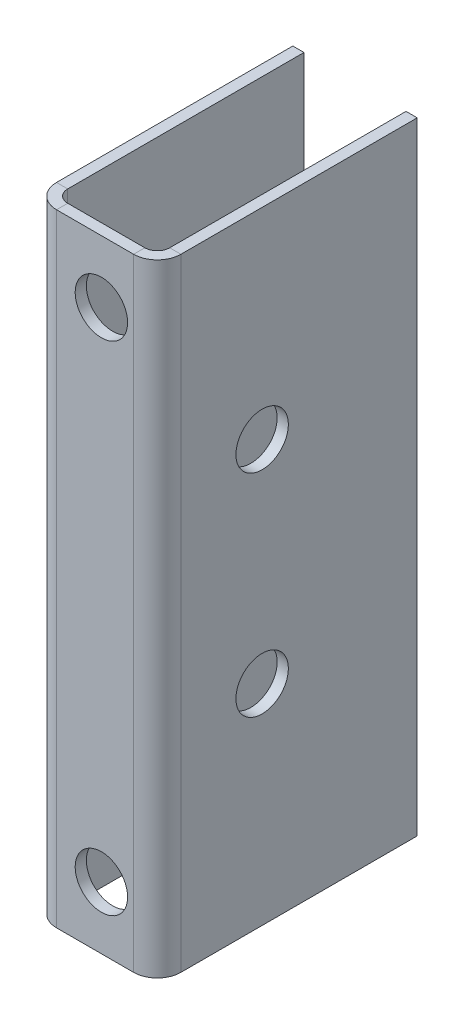
ISO-10303-21;
HEADER;
FILE_DESCRIPTION(('STEP AP214'),'2;1');
FILE_NAME('part.step','',(''),(''),'','','');
FILE_SCHEMA(('AUTOMOTIVE_DESIGN { 1 0 10303 214 1 1 1 1 }'));
ENDSEC;
DATA;
#1=APPLICATION_CONTEXT('core data for automotive mechanical design processes');
#2=APPLICATION_PROTOCOL_DEFINITION('international standard','automotive_design',2000,#1);
#3=PRODUCT_CONTEXT('',#1,'mechanical');
#4=PRODUCT('Part','Part','',(#3));
#5=PRODUCT_RELATED_PRODUCT_CATEGORY('part','',(#4));
#6=PRODUCT_DEFINITION_FORMATION('','',#4);
#7=PRODUCT_DEFINITION_CONTEXT('part definition',#1,'design');
#8=PRODUCT_DEFINITION('design','',#6,#7);
#9=PRODUCT_DEFINITION_SHAPE('','',#8);
#10=(LENGTH_UNIT() NAMED_UNIT(*) SI_UNIT(.MILLI.,.METRE.));
#11=(NAMED_UNIT(*) PLANE_ANGLE_UNIT() SI_UNIT($,.RADIAN.));
#12=(NAMED_UNIT(*) SI_UNIT($,.STERADIAN.) SOLID_ANGLE_UNIT());
#13=UNCERTAINTY_MEASURE_WITH_UNIT(LENGTH_MEASURE(1.E-05),#10,'distance_accuracy_value','');
#14=(GEOMETRIC_REPRESENTATION_CONTEXT(3) GLOBAL_UNCERTAINTY_ASSIGNED_CONTEXT((#13)) GLOBAL_UNIT_ASSIGNED_CONTEXT((#10,
#11,#12)) REPRESENTATION_CONTEXT('',''));
#15=CARTESIAN_POINT('',(0.,0.,0.));
#16=DIRECTION('',(0.,0.,1.));
#17=DIRECTION('',(1.,0.,0.));
#18=AXIS2_PLACEMENT_3D('',#15,#16,#17);
#19=CARTESIAN_POINT('',(0.,0.,-0.9));
#20=DIRECTION('',(0.,0.,1.));
#21=DIRECTION('',(1.,0.,0.));
#22=AXIS2_PLACEMENT_3D('',#19,#20,#21);
#23=PLANE('',#22);
#24=CARTESIAN_POINT('',(-3.83601900194463,40.5271084337349,-0.900000000000001));
#25=DIRECTION('',(0.,0.,-1.));
#26=DIRECTION('',(-1.,0.,0.));
#27=AXIS2_PLACEMENT_3D('',#24,#25,#26);
#28=CIRCLE('',#27,2.10819999999999);
#29=CARTESIAN_POINT('',(-5.94421900194462,40.5271084337349,-0.900000000000001));
#30=VERTEX_POINT('',#29);
#31=EDGE_CURVE('E301',#30,#30,#28,.T.);
#32=ORIENTED_EDGE('',*,*,#31,.F.);
#33=EDGE_LOOP('',(#32));
#34=FACE_BOUND('',#33,.T.);
#35=CARTESIAN_POINT('',(-3.83601900194463,0.527108433734945,-0.900000000000001));
#36=DIRECTION('',(0.,0.,-1.));
#37=DIRECTION('',(-1.,0.,0.));
#38=AXIS2_PLACEMENT_3D('',#35,#36,#37);
#39=CIRCLE('',#38,2.10819999999999);
#40=CARTESIAN_POINT('',(-5.94421900194462,0.527108433734945,-0.900000000000001));
#41=VERTEX_POINT('',#40);
#42=EDGE_CURVE('E295',#41,#41,#39,.T.);
#43=ORIENTED_EDGE('',*,*,#42,.F.);
#44=EDGE_LOOP('',(#43));
#45=FACE_BOUND('',#44,.T.);
#46=DIRECTION('',(0.,-1.,0.));
#47=VECTOR('',#46,1.);
#48=CARTESIAN_POINT('',(-1.24427710843373,-4.47289156626506,-0.9));
#49=LINE('',#48,#47);
#50=CARTESIAN_POINT('',(-1.24427710843373,-4.47289156626506,-0.9));
#51=VERTEX_POINT('',#50);
#52=CARTESIAN_POINT('',(-1.24427710843373,45.5271084337349,-0.9));
#53=VERTEX_POINT('',#52);
#54=EDGE_CURVE('E243',#51,#53,#49,.F.);
#55=ORIENTED_EDGE('',*,*,#54,.F.);
#56=DIRECTION('',(1.,0.,0.));
#57=VECTOR('',#56,1.);
#58=CARTESIAN_POINT('',(-8.44427710843374,-4.47289156626506,-0.9));
#59=LINE('',#58,#57);
#60=CARTESIAN_POINT('',(-7.44427710843374,-4.47289156626506,-0.900000000000002));
#61=VERTEX_POINT('',#60);
#62=EDGE_CURVE('E47',#61,#51,#59,.T.);
#63=ORIENTED_EDGE('',*,*,#62,.F.);
#64=DIRECTION('',(0.,1.,0.));
#65=VECTOR('',#64,1.);
#66=CARTESIAN_POINT('',(-7.44427710843374,45.5271084337349,-0.899999999999997));
#67=LINE('',#66,#65);
#68=CARTESIAN_POINT('',(-7.44427710843374,45.5271084337349,-0.899999999999997));
#69=VERTEX_POINT('',#68);
#70=EDGE_CURVE('E106',#69,#61,#67,.F.);
#71=ORIENTED_EDGE('',*,*,#70,.F.);
#72=DIRECTION('',(-1.,0.,0.));
#73=VECTOR('',#72,1.);
#74=CARTESIAN_POINT('',(-8.44427710843374,45.5271084337349,-0.9));
#75=LINE('',#74,#73);
#76=EDGE_CURVE('E11',#53,#69,#75,.T.);
#77=ORIENTED_EDGE('',*,*,#76,.F.);
#78=EDGE_LOOP('',(#55,#63,#71,#77));
#79=FACE_BOUND('',#78,.T.);
#80=ADVANCED_FACE('F38',(#34,#45,#79),#23,.F.);
#81=CARTESIAN_POINT('',(0.,0.,0.));
#82=DIRECTION('',(0.,0.,1.));
#83=DIRECTION('',(1.,0.,0.));
#84=AXIS2_PLACEMENT_3D('',#81,#82,#83);
#85=PLANE('',#84);
#86=CARTESIAN_POINT('',(-3.83601900194463,40.5271084337349,0.));
#87=DIRECTION('',(0.,0.,-1.));
#88=DIRECTION('',(-1.,0.,0.));
#89=AXIS2_PLACEMENT_3D('',#86,#87,#88);
#90=CIRCLE('',#89,2.10819999999999);
#91=CARTESIAN_POINT('',(-5.94421900194462,40.5271084337349,0.));
#92=VERTEX_POINT('',#91);
#93=EDGE_CURVE('E298',#92,#92,#90,.T.);
#94=ORIENTED_EDGE('',*,*,#93,.T.);
#95=EDGE_LOOP('',(#94));
#96=FACE_BOUND('',#95,.T.);
#97=CARTESIAN_POINT('',(-3.83601900194463,0.527108433734945,0.));
#98=DIRECTION('',(0.,0.,-1.));
#99=DIRECTION('',(-1.,0.,0.));
#100=AXIS2_PLACEMENT_3D('',#97,#98,#99);
#101=CIRCLE('',#100,2.10819999999999);
#102=CARTESIAN_POINT('',(-5.94421900194462,0.527108433734945,0.));
#103=VERTEX_POINT('',#102);
#104=EDGE_CURVE('E288',#103,#103,#101,.T.);
#105=ORIENTED_EDGE('',*,*,#104,.T.);
#106=EDGE_LOOP('',(#105));
#107=FACE_BOUND('',#106,.T.);
#108=DIRECTION('',(1.,0.,0.));
#109=VECTOR('',#108,1.);
#110=CARTESIAN_POINT('',(-8.44427710843374,-4.47289156626506,0.));
#111=LINE('',#110,#109);
#112=CARTESIAN_POINT('',(-7.44427710843374,-4.47289156626506,0.));
#113=VERTEX_POINT('',#112);
#114=CARTESIAN_POINT('',(-1.24427710843373,-4.47289156626506,0.));
#115=VERTEX_POINT('',#114);
#116=EDGE_CURVE('E147',#113,#115,#111,.T.);
#117=ORIENTED_EDGE('',*,*,#116,.T.);
#118=DIRECTION('',(0.,-1.,0.));
#119=VECTOR('',#118,1.);
#120=CARTESIAN_POINT('',(-1.24427710843373,-4.47289156626506,0.));
#121=LINE('',#120,#119);
#122=CARTESIAN_POINT('',(-1.24427710843373,45.5271084337349,0.));
#123=VERTEX_POINT('',#122);
#124=EDGE_CURVE('E157',#115,#123,#121,.F.);
#125=ORIENTED_EDGE('',*,*,#124,.T.);
#126=DIRECTION('',(-1.,0.,0.));
#127=VECTOR('',#126,1.);
#128=CARTESIAN_POINT('',(-8.44427710843374,45.5271084337349,0.));
#129=LINE('',#128,#127);
#130=CARTESIAN_POINT('',(-7.44427710843375,45.5271084337349,0.));
#131=VERTEX_POINT('',#130);
#132=EDGE_CURVE('E64',#123,#131,#129,.T.);
#133=ORIENTED_EDGE('',*,*,#132,.T.);
#134=DIRECTION('',(0.,1.,0.));
#135=VECTOR('',#134,1.);
#136=CARTESIAN_POINT('',(-7.44427710843375,45.5271084337349,0.));
#137=LINE('',#136,#135);
#138=EDGE_CURVE('E138',#131,#113,#137,.F.);
#139=ORIENTED_EDGE('',*,*,#138,.T.);
#140=EDGE_LOOP('',(#117,#125,#133,#139));
#141=FACE_BOUND('',#140,.T.);
#142=ADVANCED_FACE('F154',(#96,#107,#141),#85,.T.);
#143=CARTESIAN_POINT('',(-8.44427710843374,-4.47289156626506,-0.9));
#144=DIRECTION('',(0.,-1.,0.));
#145=DIRECTION('',(0.,0.,-1.));
#146=AXIS2_PLACEMENT_3D('',#143,#144,#145);
#147=PLANE('',#146);
#148=ORIENTED_EDGE('',*,*,#62,.T.);
#149=DIRECTION('',(0.,0.,1.));
#150=VECTOR('',#149,1.);
#151=CARTESIAN_POINT('',(-1.24427710843373,-4.47289156626506,-0.9));
#152=LINE('',#151,#150);
#153=EDGE_CURVE('E165',#51,#115,#152,.T.);
#154=ORIENTED_EDGE('',*,*,#153,.T.);
#155=ORIENTED_EDGE('',*,*,#116,.F.);
#156=DIRECTION('',(0.,0.,1.));
#157=VECTOR('',#156,1.);
#158=CARTESIAN_POINT('',(-7.44427710843374,-4.47289156626506,-0.900000000000002));
#159=LINE('',#158,#157);
#160=EDGE_CURVE('E145',#61,#113,#159,.T.);
#161=ORIENTED_EDGE('',*,*,#160,.F.);
#162=EDGE_LOOP('',(#148,#154,#155,#161));
#163=FACE_BOUND('',#162,.T.);
#164=ADVANCED_FACE('F40',(#163),#147,.T.);
#165=CARTESIAN_POINT('',(-8.44427710843374,45.5271084337349,-0.9));
#166=DIRECTION('',(0.,1.,0.));
#167=DIRECTION('',(-1.,0.,0.));
#168=AXIS2_PLACEMENT_3D('',#165,#166,#167);
#169=PLANE('',#168);
#170=DIRECTION('',(0.,0.,1.));
#171=VECTOR('',#170,1.);
#172=CARTESIAN_POINT('',(-1.24427710843373,45.5271084337349,-0.9));
#173=LINE('',#172,#171);
#174=EDGE_CURVE('E171',#53,#123,#173,.T.);
#175=ORIENTED_EDGE('',*,*,#174,.F.);
#176=ORIENTED_EDGE('',*,*,#76,.T.);
#177=DIRECTION('',(0.,0.,1.));
#178=VECTOR('',#177,1.);
#179=CARTESIAN_POINT('',(-7.44427710843374,45.5271084337349,-0.899999999999997));
#180=LINE('',#179,#178);
#181=EDGE_CURVE('E105',#69,#131,#180,.T.);
#182=ORIENTED_EDGE('',*,*,#181,.T.);
#183=ORIENTED_EDGE('',*,*,#132,.F.);
#184=EDGE_LOOP('',(#175,#176,#182,#183));
#185=FACE_BOUND('',#184,.T.);
#186=ADVANCED_FACE('F226',(#185),#169,.T.);
#187=CARTESIAN_POINT('',(-7.44427710843374,-4.47289156626506,-1.9));
#188=DIRECTION('',(0.,-1.,0.));
#189=DIRECTION('',(0.,0.,-1.));
#190=AXIS2_PLACEMENT_3D('',#187,#188,#189);
#191=PLANE('',#190);
#192=DIRECTION('',(-1.,0.,0.));
#193=VECTOR('',#192,1.);
#194=CARTESIAN_POINT('',(-8.44427710843374,-4.47289156626506,-1.9));
#195=LINE('',#194,#193);
#196=CARTESIAN_POINT('',(-8.44427710843374,-4.47289156626506,-1.9));
#197=VERTEX_POINT('',#196);
#198=CARTESIAN_POINT('',(-9.34427710843374,-4.47289156626506,-1.89999999999999));
#199=VERTEX_POINT('',#198);
#200=EDGE_CURVE('E94',#197,#199,#195,.T.);
#201=ORIENTED_EDGE('',*,*,#200,.F.);
#202=CARTESIAN_POINT('',(-7.44427710843374,-4.47289156626506,-1.9));
#203=DIRECTION('',(0.,1.,0.));
#204=DIRECTION('',(0.,0.,1.));
#205=AXIS2_PLACEMENT_3D('',#202,#203,#204);
#206=CIRCLE('',#205,0.999999999999997);
#207=EDGE_CURVE('E88',#61,#197,#206,.F.);
#208=ORIENTED_EDGE('',*,*,#207,.F.);
#209=ORIENTED_EDGE('',*,*,#160,.T.);
#210=CARTESIAN_POINT('',(-7.44427710843374,-4.47289156626506,-1.9));
#211=DIRECTION('',(0.,1.,0.));
#212=DIRECTION('',(0.,0.,1.));
#213=AXIS2_PLACEMENT_3D('',#210,#211,#212);
#214=CIRCLE('',#213,1.9);
#215=EDGE_CURVE('E55',#113,#199,#214,.F.);
#216=ORIENTED_EDGE('',*,*,#215,.T.);
#217=EDGE_LOOP('',(#201,#208,#209,#216));
#218=FACE_BOUND('',#217,.T.);
#219=ADVANCED_FACE('F228',(#218),#191,.T.);
#220=CARTESIAN_POINT('',(-7.44427710843374,45.5271084337349,-1.89999999999999));
#221=DIRECTION('',(0.,-1.,0.));
#222=DIRECTION('',(0.,0.,-1.));
#223=AXIS2_PLACEMENT_3D('',#220,#221,#222);
#224=PLANE('',#223);
#225=CARTESIAN_POINT('',(-7.44427710843374,45.5271084337349,-1.89999999999999));
#226=DIRECTION('',(0.,1.,0.));
#227=DIRECTION('',(0.,0.,1.));
#228=AXIS2_PLACEMENT_3D('',#225,#226,#227);
#229=CIRCLE('',#228,0.999999999999997);
#230=CARTESIAN_POINT('',(-8.44427710843374,45.5271084337349,-1.89999999999999));
#231=VERTEX_POINT('',#230);
#232=EDGE_CURVE('E85',#231,#69,#229,.T.);
#233=ORIENTED_EDGE('',*,*,#232,.F.);
#234=DIRECTION('',(-1.,0.,0.));
#235=VECTOR('',#234,1.);
#236=CARTESIAN_POINT('',(-8.44427710843375,45.5271084337349,-1.89999999999999));
#237=LINE('',#236,#235);
#238=CARTESIAN_POINT('',(-9.34427710843374,45.5271084337349,-1.89999999999999));
#239=VERTEX_POINT('',#238);
#240=EDGE_CURVE('E93',#231,#239,#237,.T.);
#241=ORIENTED_EDGE('',*,*,#240,.T.);
#242=CARTESIAN_POINT('',(-7.44427710843374,45.5271084337349,-1.89999999999999));
#243=DIRECTION('',(0.,1.,0.));
#244=DIRECTION('',(0.,0.,1.));
#245=AXIS2_PLACEMENT_3D('',#242,#243,#244);
#246=CIRCLE('',#245,1.9);
#247=EDGE_CURVE('E140',#239,#131,#246,.T.);
#248=ORIENTED_EDGE('',*,*,#247,.T.);
#249=ORIENTED_EDGE('',*,*,#181,.F.);
#250=EDGE_LOOP('',(#233,#241,#248,#249));
#251=FACE_BOUND('',#250,.T.);
#252=ADVANCED_FACE('F100',(#251),#224,.F.);
#253=CARTESIAN_POINT('',(-7.44427710843374,45.5271084337349,-1.89999999999999));
#254=DIRECTION('',(0.,1.,0.));
#255=DIRECTION('',(-1.,0.,0.));
#256=AXIS2_PLACEMENT_3D('',#253,#254,#255);
#257=CYLINDRICAL_SURFACE('',#256,1.9);
#258=ORIENTED_EDGE('',*,*,#138,.F.);
#259=ORIENTED_EDGE('',*,*,#247,.F.);
#260=DIRECTION('',(0.,-1.,0.));
#261=VECTOR('',#260,1.);
#262=CARTESIAN_POINT('',(-9.34427710843374,0.,-1.89999999999999));
#263=LINE('',#262,#261);
#264=EDGE_CURVE('E119',#239,#199,#263,.T.);
#265=ORIENTED_EDGE('',*,*,#264,.T.);
#266=ORIENTED_EDGE('',*,*,#215,.F.);
#267=EDGE_LOOP('',(#258,#259,#265,#266));
#268=FACE_BOUND('',#267,.T.);
#269=ADVANCED_FACE('F374',(#268),#257,.T.);
#270=CARTESIAN_POINT('',(-7.44427710843374,45.5271084337349,-1.89999999999999));
#271=DIRECTION('',(0.,1.,0.));
#272=DIRECTION('',(-1.,0.,0.));
#273=AXIS2_PLACEMENT_3D('',#270,#271,#272);
#274=CYLINDRICAL_SURFACE('',#273,0.999999999999997);
#275=ORIENTED_EDGE('',*,*,#70,.T.);
#276=ORIENTED_EDGE('',*,*,#207,.T.);
#277=DIRECTION('',(0.,1.,0.));
#278=VECTOR('',#277,1.);
#279=CARTESIAN_POINT('',(-8.44427710843374,-4.47289156626506,-1.9));
#280=LINE('',#279,#278);
#281=EDGE_CURVE('E82',#197,#231,#280,.T.);
#282=ORIENTED_EDGE('',*,*,#281,.T.);
#283=ORIENTED_EDGE('',*,*,#232,.T.);
#284=EDGE_LOOP('',(#275,#276,#282,#283));
#285=FACE_BOUND('',#284,.T.);
#286=ADVANCED_FACE('F84',(#285),#274,.F.);
#287=CARTESIAN_POINT('',(-9.34427710843381,45.5271084337349,-20.9));
#288=DIRECTION('',(0.,-1.,0.));
#289=DIRECTION('',(1.,0.,0.));
#290=AXIS2_PLACEMENT_3D('',#287,#288,#289);
#291=PLANE('',#290);
#292=ORIENTED_EDGE('',*,*,#240,.F.);
#293=DIRECTION('',(0.,0.,-1.));
#294=VECTOR('',#293,1.);
#295=CARTESIAN_POINT('',(-8.44427710843381,45.5271084337349,-20.9));
#296=LINE('',#295,#294);
#297=CARTESIAN_POINT('',(-8.44427710843381,45.5271084337349,-20.9));
#298=VERTEX_POINT('',#297);
#299=EDGE_CURVE('E115',#231,#298,#296,.T.);
#300=ORIENTED_EDGE('',*,*,#299,.T.);
#301=DIRECTION('',(1.,0.,0.));
#302=VECTOR('',#301,1.);
#303=CARTESIAN_POINT('',(-9.34427710843381,45.5271084337349,-20.9));
#304=LINE('',#303,#302);
#305=CARTESIAN_POINT('',(-9.34427710843381,45.5271084337349,-20.9));
#306=VERTEX_POINT('',#305);
#307=EDGE_CURVE('E107',#306,#298,#304,.T.);
#308=ORIENTED_EDGE('',*,*,#307,.F.);
#309=DIRECTION('',(0.,0.,-1.));
#310=VECTOR('',#309,1.);
#311=CARTESIAN_POINT('',(-9.34427710843381,45.5271084337349,-20.9));
#312=LINE('',#311,#310);
#313=EDGE_CURVE('E118',#239,#306,#312,.T.);
#314=ORIENTED_EDGE('',*,*,#313,.F.);
#315=EDGE_LOOP('',(#292,#300,#308,#314));
#316=FACE_BOUND('',#315,.T.);
#317=ADVANCED_FACE('F112',(#316),#291,.F.);
#318=CARTESIAN_POINT('',(-9.34427710843374,-4.47289156626506,-0.899999999999997));
#319=DIRECTION('',(0.,1.,0.));
#320=DIRECTION('',(-1.,0.,0.));
#321=AXIS2_PLACEMENT_3D('',#318,#319,#320);
#322=PLANE('',#321);
#323=ORIENTED_EDGE('',*,*,#200,.T.);
#324=DIRECTION('',(0.,0.,1.));
#325=VECTOR('',#324,1.);
#326=CARTESIAN_POINT('',(-9.34427710843374,-4.47289156626506,-0.899999999999997));
#327=LINE('',#326,#325);
#328=CARTESIAN_POINT('',(-9.34427710843381,-4.47289156626506,-20.9));
#329=VERTEX_POINT('',#328);
#330=EDGE_CURVE('E130',#329,#199,#327,.T.);
#331=ORIENTED_EDGE('',*,*,#330,.F.);
#332=DIRECTION('',(1.,0.,0.));
#333=VECTOR('',#332,1.);
#334=CARTESIAN_POINT('',(-9.34427710843381,-4.47289156626506,-20.9));
#335=LINE('',#334,#333);
#336=CARTESIAN_POINT('',(-8.44427710843381,-4.47289156626506,-20.9));
#337=VERTEX_POINT('',#336);
#338=EDGE_CURVE('E134',#329,#337,#335,.T.);
#339=ORIENTED_EDGE('',*,*,#338,.T.);
#340=DIRECTION('',(0.,0.,1.));
#341=VECTOR('',#340,1.);
#342=CARTESIAN_POINT('',(-8.44427710843374,-4.47289156626506,-0.9));
#343=LINE('',#342,#341);
#344=EDGE_CURVE('E126',#337,#197,#343,.T.);
#345=ORIENTED_EDGE('',*,*,#344,.T.);
#346=EDGE_LOOP('',(#323,#331,#339,#345));
#347=FACE_BOUND('',#346,.T.);
#348=ADVANCED_FACE('F191',(#347),#322,.F.);
#349=CARTESIAN_POINT('',(-9.34427710843373,0.,0.));
#350=DIRECTION('',(1.,0.,0.));
#351=DIRECTION('',(0.,0.,-1.));
#352=AXIS2_PLACEMENT_3D('',#349,#350,#351);
#353=PLANE('',#352);
#354=CARTESIAN_POINT('',(-9.34427710843385,29.3672841016306,-8.43208069583038));
#355=DIRECTION('',(1.,0.,0.));
#356=DIRECTION('',(0.,0.,-1.));
#357=AXIS2_PLACEMENT_3D('',#354,#355,#356);
#358=CIRCLE('',#357,2.1082);
#359=CARTESIAN_POINT('',(-9.34427710843385,29.3672841016306,-10.5402806958304));
#360=VERTEX_POINT('',#359);
#361=EDGE_CURVE('E319',#360,#360,#358,.T.);
#362=ORIENTED_EDGE('',*,*,#361,.T.);
#363=EDGE_LOOP('',(#362));
#364=FACE_BOUND('',#363,.T.);
#365=CARTESIAN_POINT('',(-9.34427710843385,12.3672841016307,-8.43208069583035));
#366=DIRECTION('',(1.,0.,0.));
#367=DIRECTION('',(0.,0.,-1.));
#368=AXIS2_PLACEMENT_3D('',#365,#366,#367);
#369=CIRCLE('',#368,2.1082);
#370=CARTESIAN_POINT('',(-9.34427710843385,12.3672841016307,-10.5402806958304));
#371=VERTEX_POINT('',#370);
#372=EDGE_CURVE('E307',#371,#371,#369,.T.);
#373=ORIENTED_EDGE('',*,*,#372,.T.);
#374=EDGE_LOOP('',(#373));
#375=FACE_BOUND('',#374,.T.);
#376=ORIENTED_EDGE('',*,*,#264,.F.);
#377=ORIENTED_EDGE('',*,*,#313,.T.);
#378=DIRECTION('',(0.,-1.,0.));
#379=VECTOR('',#378,1.);
#380=CARTESIAN_POINT('',(-9.34427710843381,-4.47289156626506,-20.9));
#381=LINE('',#380,#379);
#382=EDGE_CURVE('E182',#306,#329,#381,.T.);
#383=ORIENTED_EDGE('',*,*,#382,.T.);
#384=ORIENTED_EDGE('',*,*,#330,.T.);
#385=EDGE_LOOP('',(#376,#377,#383,#384));
#386=FACE_BOUND('',#385,.T.);
#387=ADVANCED_FACE('F189',(#364,#375,#386),#353,.F.);
#388=CARTESIAN_POINT('',(-8.44427710843373,0.,0.));
#389=DIRECTION('',(1.,0.,0.));
#390=DIRECTION('',(0.,0.,-1.));
#391=AXIS2_PLACEMENT_3D('',#388,#389,#390);
#392=PLANE('',#391);
#393=CARTESIAN_POINT('',(-8.44427710843376,29.3672841016306,-8.43208069583038));
#394=DIRECTION('',(1.,0.,0.));
#395=DIRECTION('',(0.,0.,-1.));
#396=AXIS2_PLACEMENT_3D('',#393,#394,#395);
#397=CIRCLE('',#396,2.10819999999999);
#398=CARTESIAN_POINT('',(-8.44427710843377,29.3672841016306,-10.5402806958304));
#399=VERTEX_POINT('',#398);
#400=EDGE_CURVE('E316',#399,#399,#397,.T.);
#401=ORIENTED_EDGE('',*,*,#400,.F.);
#402=EDGE_LOOP('',(#401));
#403=FACE_BOUND('',#402,.T.);
#404=CARTESIAN_POINT('',(-8.44427710843376,12.3672841016307,-8.43208069583035));
#405=DIRECTION('',(1.,0.,0.));
#406=DIRECTION('',(0.,0.,-1.));
#407=AXIS2_PLACEMENT_3D('',#404,#405,#406);
#408=CIRCLE('',#407,2.10819999999999);
#409=CARTESIAN_POINT('',(-8.44427710843377,12.3672841016307,-10.5402806958303));
#410=VERTEX_POINT('',#409);
#411=EDGE_CURVE('E304',#410,#410,#408,.T.);
#412=ORIENTED_EDGE('',*,*,#411,.F.);
#413=EDGE_LOOP('',(#412));
#414=FACE_BOUND('',#413,.T.);
#415=ORIENTED_EDGE('',*,*,#299,.F.);
#416=ORIENTED_EDGE('',*,*,#281,.F.);
#417=ORIENTED_EDGE('',*,*,#344,.F.);
#418=DIRECTION('',(0.,-1.,0.));
#419=VECTOR('',#418,1.);
#420=CARTESIAN_POINT('',(-8.44427710843381,-4.47289156626506,-20.9));
#421=LINE('',#420,#419);
#422=EDGE_CURVE('E123',#298,#337,#421,.T.);
#423=ORIENTED_EDGE('',*,*,#422,.F.);
#424=EDGE_LOOP('',(#415,#416,#417,#423));
#425=FACE_BOUND('',#424,.T.);
#426=ADVANCED_FACE('F121',(#403,#414,#425),#392,.T.);
#427=CARTESIAN_POINT('',(-9.34427710843381,-4.47289156626506,-20.9));
#428=DIRECTION('',(0.,0.,1.));
#429=DIRECTION('',(1.,0.,0.));
#430=AXIS2_PLACEMENT_3D('',#427,#428,#429);
#431=PLANE('',#430);
#432=ORIENTED_EDGE('',*,*,#422,.T.);
#433=ORIENTED_EDGE('',*,*,#338,.F.);
#434=ORIENTED_EDGE('',*,*,#382,.F.);
#435=ORIENTED_EDGE('',*,*,#307,.T.);
#436=EDGE_LOOP('',(#432,#433,#434,#435));
#437=FACE_BOUND('',#436,.T.);
#438=ADVANCED_FACE('F199',(#437),#431,.F.);
#439=CARTESIAN_POINT('',(-1.24427710843373,45.5271084337349,-1.9));
#440=DIRECTION('',(0.,1.,0.));
#441=DIRECTION('',(0.,0.,1.));
#442=AXIS2_PLACEMENT_3D('',#439,#440,#441);
#443=PLANE('',#442);
#444=DIRECTION('',(1.,0.,0.));
#445=VECTOR('',#444,1.);
#446=CARTESIAN_POINT('',(-0.244277108433734,45.5271084337349,-1.9));
#447=LINE('',#446,#445);
#448=CARTESIAN_POINT('',(-0.244277108433734,45.5271084337349,-1.9));
#449=VERTEX_POINT('',#448);
#450=CARTESIAN_POINT('',(0.655722891566267,45.5271084337349,-1.89999999999999));
#451=VERTEX_POINT('',#450);
#452=EDGE_CURVE('E284',#449,#451,#447,.T.);
#453=ORIENTED_EDGE('',*,*,#452,.F.);
#454=CARTESIAN_POINT('',(-1.24427710843373,45.5271084337349,-1.9));
#455=DIRECTION('',(0.,-1.,0.));
#456=DIRECTION('',(0.,0.,-1.));
#457=AXIS2_PLACEMENT_3D('',#454,#455,#456);
#458=CIRCLE('',#457,1.);
#459=EDGE_CURVE('E248',#53,#449,#458,.F.);
#460=ORIENTED_EDGE('',*,*,#459,.F.);
#461=ORIENTED_EDGE('',*,*,#174,.T.);
#462=CARTESIAN_POINT('',(-1.24427710843373,45.5271084337349,-1.9));
#463=DIRECTION('',(0.,-1.,0.));
#464=DIRECTION('',(0.,0.,-1.));
#465=AXIS2_PLACEMENT_3D('',#462,#463,#464);
#466=CIRCLE('',#465,1.9);
#467=EDGE_CURVE('E172',#123,#451,#466,.F.);
#468=ORIENTED_EDGE('',*,*,#467,.T.);
#469=EDGE_LOOP('',(#453,#460,#461,#468));
#470=FACE_BOUND('',#469,.T.);
#471=ADVANCED_FACE('F201',(#470),#443,.T.);
#472=CARTESIAN_POINT('',(-1.24427710843373,-4.47289156626506,-1.9));
#473=DIRECTION('',(0.,1.,0.));
#474=DIRECTION('',(0.,0.,1.));
#475=AXIS2_PLACEMENT_3D('',#472,#473,#474);
#476=PLANE('',#475);
#477=CARTESIAN_POINT('',(-1.24427710843373,-4.47289156626506,-1.9));
#478=DIRECTION('',(0.,-1.,0.));
#479=DIRECTION('',(0.,0.,-1.));
#480=AXIS2_PLACEMENT_3D('',#477,#478,#479);
#481=CIRCLE('',#480,1.);
#482=CARTESIAN_POINT('',(-0.244277108433734,-4.47289156626506,-1.9));
#483=VERTEX_POINT('',#482);
#484=EDGE_CURVE('E249',#483,#51,#481,.T.);
#485=ORIENTED_EDGE('',*,*,#484,.F.);
#486=DIRECTION('',(1.,0.,0.));
#487=VECTOR('',#486,1.);
#488=CARTESIAN_POINT('',(-0.244277108433734,-4.47289156626506,-1.9));
#489=LINE('',#488,#487);
#490=CARTESIAN_POINT('',(0.655722891566267,-4.47289156626506,-1.89999999999999));
#491=VERTEX_POINT('',#490);
#492=EDGE_CURVE('E283',#483,#491,#489,.T.);
#493=ORIENTED_EDGE('',*,*,#492,.T.);
#494=CARTESIAN_POINT('',(-1.24427710843373,-4.47289156626506,-1.9));
#495=DIRECTION('',(0.,-1.,0.));
#496=DIRECTION('',(0.,0.,-1.));
#497=AXIS2_PLACEMENT_3D('',#494,#495,#496);
#498=CIRCLE('',#497,1.9);
#499=EDGE_CURVE('E251',#491,#115,#498,.T.);
#500=ORIENTED_EDGE('',*,*,#499,.T.);
#501=ORIENTED_EDGE('',*,*,#153,.F.);
#502=EDGE_LOOP('',(#485,#493,#500,#501));
#503=FACE_BOUND('',#502,.T.);
#504=ADVANCED_FACE('F207',(#503),#476,.F.);
#505=CARTESIAN_POINT('',(-1.24427710843373,-4.47289156626506,-1.9));
#506=DIRECTION('',(0.,-1.,0.));
#507=DIRECTION('',(1.,0.,0.));
#508=AXIS2_PLACEMENT_3D('',#505,#506,#507);
#509=CYLINDRICAL_SURFACE('',#508,1.9);
#510=ORIENTED_EDGE('',*,*,#124,.F.);
#511=ORIENTED_EDGE('',*,*,#499,.F.);
#512=DIRECTION('',(0.,-1.,0.));
#513=VECTOR('',#512,1.);
#514=CARTESIAN_POINT('',(0.655722891566267,0.,-1.89999999999999));
#515=LINE('',#514,#513);
#516=EDGE_CURVE('E273',#451,#491,#515,.T.);
#517=ORIENTED_EDGE('',*,*,#516,.F.);
#518=ORIENTED_EDGE('',*,*,#467,.F.);
#519=EDGE_LOOP('',(#510,#511,#517,#518));
#520=FACE_BOUND('',#519,.T.);
#521=ADVANCED_FACE('F393',(#520),#509,.T.);
#522=CARTESIAN_POINT('',(-1.24427710843373,-4.47289156626506,-1.9));
#523=DIRECTION('',(0.,-1.,0.));
#524=DIRECTION('',(1.,0.,0.));
#525=AXIS2_PLACEMENT_3D('',#522,#523,#524);
#526=CYLINDRICAL_SURFACE('',#525,1.);
#527=ORIENTED_EDGE('',*,*,#54,.T.);
#528=ORIENTED_EDGE('',*,*,#459,.T.);
#529=DIRECTION('',(0.,-1.,0.));
#530=VECTOR('',#529,1.);
#531=CARTESIAN_POINT('',(-0.244277108433734,45.5271084337349,-1.9));
#532=LINE('',#531,#530);
#533=EDGE_CURVE('E287',#449,#483,#532,.T.);
#534=ORIENTED_EDGE('',*,*,#533,.T.);
#535=ORIENTED_EDGE('',*,*,#484,.T.);
#536=EDGE_LOOP('',(#527,#528,#534,#535));
#537=FACE_BOUND('',#536,.T.);
#538=ADVANCED_FACE('F395',(#537),#526,.F.);
#539=CARTESIAN_POINT('',(0.655722891566263,-4.47289156626506,-0.899999999999997));
#540=DIRECTION('',(0.,-1.,0.));
#541=DIRECTION('',(0.,0.,-1.));
#542=AXIS2_PLACEMENT_3D('',#539,#540,#541);
#543=PLANE('',#542);
#544=DIRECTION('',(0.,0.,1.));
#545=VECTOR('',#544,1.);
#546=CARTESIAN_POINT('',(0.655722891566263,-4.47289156626506,-0.899999999999997));
#547=LINE('',#546,#545);
#548=CARTESIAN_POINT('',(0.655722891566333,-4.47289156626506,-20.9));
#549=VERTEX_POINT('',#548);
#550=EDGE_CURVE('E260',#549,#491,#547,.T.);
#551=ORIENTED_EDGE('',*,*,#550,.T.);
#552=ORIENTED_EDGE('',*,*,#492,.F.);
#553=DIRECTION('',(0.,0.,1.));
#554=VECTOR('',#553,1.);
#555=CARTESIAN_POINT('',(-0.244277108433737,-4.47289156626506,-0.9));
#556=LINE('',#555,#554);
#557=CARTESIAN_POINT('',(-0.244277108433667,-4.47289156626506,-20.9));
#558=VERTEX_POINT('',#557);
#559=EDGE_CURVE('E263',#558,#483,#556,.T.);
#560=ORIENTED_EDGE('',*,*,#559,.F.);
#561=DIRECTION('',(-1.,0.,0.));
#562=VECTOR('',#561,1.);
#563=CARTESIAN_POINT('',(0.655722891566333,-4.47289156626506,-20.9));
#564=LINE('',#563,#562);
#565=EDGE_CURVE('E253',#549,#558,#564,.T.);
#566=ORIENTED_EDGE('',*,*,#565,.F.);
#567=EDGE_LOOP('',(#551,#552,#560,#566));
#568=FACE_BOUND('',#567,.T.);
#569=ADVANCED_FACE('F363',(#568),#543,.T.);
#570=CARTESIAN_POINT('',(0.655722891566333,45.5271084337349,-20.9));
#571=DIRECTION('',(0.,1.,0.));
#572=DIRECTION('',(0.,0.,1.));
#573=AXIS2_PLACEMENT_3D('',#570,#571,#572);
#574=PLANE('',#573);
#575=DIRECTION('',(0.,0.,-1.));
#576=VECTOR('',#575,1.);
#577=CARTESIAN_POINT('',(-0.244277108433667,45.5271084337349,-20.9));
#578=LINE('',#577,#576);
#579=CARTESIAN_POINT('',(-0.244277108433667,45.5271084337349,-20.9));
#580=VERTEX_POINT('',#579);
#581=EDGE_CURVE('E270',#449,#580,#578,.T.);
#582=ORIENTED_EDGE('',*,*,#581,.F.);
#583=ORIENTED_EDGE('',*,*,#452,.T.);
#584=DIRECTION('',(0.,0.,-1.));
#585=VECTOR('',#584,1.);
#586=CARTESIAN_POINT('',(0.655722891566333,45.5271084337349,-20.9));
#587=LINE('',#586,#585);
#588=CARTESIAN_POINT('',(0.655722891566333,45.5271084337349,-20.9));
#589=VERTEX_POINT('',#588);
#590=EDGE_CURVE('E266',#451,#589,#587,.T.);
#591=ORIENTED_EDGE('',*,*,#590,.T.);
#592=DIRECTION('',(-1.,0.,0.));
#593=VECTOR('',#592,1.);
#594=CARTESIAN_POINT('',(0.655722891566333,45.5271084337349,-20.9));
#595=LINE('',#594,#593);
#596=EDGE_CURVE('E257',#589,#580,#595,.T.);
#597=ORIENTED_EDGE('',*,*,#596,.T.);
#598=EDGE_LOOP('',(#582,#583,#591,#597));
#599=FACE_BOUND('',#598,.T.);
#600=ADVANCED_FACE('F333',(#599),#574,.T.);
#601=CARTESIAN_POINT('',(0.65572289156626,0.,0.));
#602=DIRECTION('',(1.,0.,0.));
#603=DIRECTION('',(0.,0.,-1.));
#604=AXIS2_PLACEMENT_3D('',#601,#602,#603);
#605=PLANE('',#604);
#606=CARTESIAN_POINT('',(0.655722891566291,29.3672841016306,-8.43208069583035));
#607=DIRECTION('',(1.,0.,0.));
#608=DIRECTION('',(0.,0.,-1.));
#609=AXIS2_PLACEMENT_3D('',#606,#607,#608);
#610=CIRCLE('',#609,2.10819999999998);
#611=CARTESIAN_POINT('',(0.655722891566298,29.3672841016306,-10.5402806958303));
#612=VERTEX_POINT('',#611);
#613=EDGE_CURVE('E322',#612,#612,#610,.T.);
#614=ORIENTED_EDGE('',*,*,#613,.F.);
#615=EDGE_LOOP('',(#614));
#616=FACE_BOUND('',#615,.T.);
#617=CARTESIAN_POINT('',(0.655722891566291,12.3672841016307,-8.43208069583032));
#618=DIRECTION('',(1.,0.,0.));
#619=DIRECTION('',(0.,0.,-1.));
#620=AXIS2_PLACEMENT_3D('',#617,#618,#619);
#621=CIRCLE('',#620,2.10819999999999);
#622=CARTESIAN_POINT('',(0.655722891566298,12.3672841016307,-10.5402806958303));
#623=VERTEX_POINT('',#622);
#624=EDGE_CURVE('E310',#623,#623,#621,.T.);
#625=ORIENTED_EDGE('',*,*,#624,.F.);
#626=EDGE_LOOP('',(#625));
#627=FACE_BOUND('',#626,.T.);
#628=ORIENTED_EDGE('',*,*,#590,.F.);
#629=ORIENTED_EDGE('',*,*,#516,.T.);
#630=ORIENTED_EDGE('',*,*,#550,.F.);
#631=DIRECTION('',(0.,-1.,0.));
#632=VECTOR('',#631,1.);
#633=CARTESIAN_POINT('',(0.655722891566333,-4.47289156626506,-20.9));
#634=LINE('',#633,#632);
#635=EDGE_CURVE('E276',#589,#549,#634,.T.);
#636=ORIENTED_EDGE('',*,*,#635,.F.);
#637=EDGE_LOOP('',(#628,#629,#630,#636));
#638=FACE_BOUND('',#637,.T.);
#639=ADVANCED_FACE('F329',(#616,#627,#638),#605,.T.);
#640=CARTESIAN_POINT('',(-0.24427710843374,0.,0.));
#641=DIRECTION('',(1.,0.,0.));
#642=DIRECTION('',(0.,0.,-1.));
#643=AXIS2_PLACEMENT_3D('',#640,#641,#642);
#644=PLANE('',#643);
#645=CARTESIAN_POINT('',(-0.244277108433711,29.3672841016306,-8.43208069583035));
#646=DIRECTION('',(1.,0.,0.));
#647=DIRECTION('',(0.,0.,-1.));
#648=AXIS2_PLACEMENT_3D('',#645,#646,#647);
#649=CIRCLE('',#648,2.10819999999999);
#650=CARTESIAN_POINT('',(-0.244277108433703,29.3672841016306,-10.5402806958303));
#651=VERTEX_POINT('',#650);
#652=EDGE_CURVE('E313',#651,#651,#649,.T.);
#653=ORIENTED_EDGE('',*,*,#652,.T.);
#654=EDGE_LOOP('',(#653));
#655=FACE_BOUND('',#654,.T.);
#656=CARTESIAN_POINT('',(-0.244277108433711,12.3672841016307,-8.43208069583032));
#657=DIRECTION('',(1.,0.,0.));
#658=DIRECTION('',(0.,0.,-1.));
#659=AXIS2_PLACEMENT_3D('',#656,#657,#658);
#660=CIRCLE('',#659,2.10819999999999);
#661=CARTESIAN_POINT('',(-0.244277108433703,12.3672841016307,-10.5402806958303));
#662=VERTEX_POINT('',#661);
#663=EDGE_CURVE('E42',#662,#662,#660,.T.);
#664=ORIENTED_EDGE('',*,*,#663,.T.);
#665=EDGE_LOOP('',(#664));
#666=FACE_BOUND('',#665,.T.);
#667=ORIENTED_EDGE('',*,*,#533,.F.);
#668=ORIENTED_EDGE('',*,*,#581,.T.);
#669=DIRECTION('',(0.,-1.,0.));
#670=VECTOR('',#669,1.);
#671=CARTESIAN_POINT('',(-0.244277108433667,-4.47289156626506,-20.9));
#672=LINE('',#671,#670);
#673=EDGE_CURVE('E267',#580,#558,#672,.T.);
#674=ORIENTED_EDGE('',*,*,#673,.T.);
#675=ORIENTED_EDGE('',*,*,#559,.T.);
#676=EDGE_LOOP('',(#667,#668,#674,#675));
#677=FACE_BOUND('',#676,.T.);
#678=ADVANCED_FACE('F332',(#655,#666,#677),#644,.F.);
#679=CARTESIAN_POINT('',(0.655722891566333,-4.47289156626506,-20.9));
#680=DIRECTION('',(0.,0.,-1.));
#681=DIRECTION('',(-1.,0.,0.));
#682=AXIS2_PLACEMENT_3D('',#679,#680,#681);
#683=PLANE('',#682);
#684=ORIENTED_EDGE('',*,*,#673,.F.);
#685=ORIENTED_EDGE('',*,*,#596,.F.);
#686=ORIENTED_EDGE('',*,*,#635,.T.);
#687=ORIENTED_EDGE('',*,*,#565,.T.);
#688=EDGE_LOOP('',(#684,#685,#686,#687));
#689=FACE_BOUND('',#688,.T.);
#690=ADVANCED_FACE('F354',(#689),#683,.T.);
#691=CARTESIAN_POINT('',(-3.83601900194463,0.527108433734945,-0.9));
#692=DIRECTION('',(0.,0.,-1.));
#693=DIRECTION('',(-1.,0.,0.));
#694=AXIS2_PLACEMENT_3D('',#691,#692,#693);
#695=CYLINDRICAL_SURFACE('',#694,2.10819999999999);
#696=ORIENTED_EDGE('',*,*,#104,.F.);
#697=EDGE_LOOP('',(#696));
#698=FACE_BOUND('',#697,.T.);
#699=ORIENTED_EDGE('',*,*,#42,.T.);
#700=EDGE_LOOP('',(#699));
#701=FACE_BOUND('',#700,.T.);
#702=ADVANCED_FACE('F404',(#698,#701),#695,.F.);
#703=CARTESIAN_POINT('',(-3.83601900194463,40.5271084337349,-0.9));
#704=DIRECTION('',(0.,0.,-1.));
#705=DIRECTION('',(-1.,0.,0.));
#706=AXIS2_PLACEMENT_3D('',#703,#704,#705);
#707=CYLINDRICAL_SURFACE('',#706,2.10819999999999);
#708=ORIENTED_EDGE('',*,*,#93,.F.);
#709=EDGE_LOOP('',(#708));
#710=FACE_BOUND('',#709,.T.);
#711=ORIENTED_EDGE('',*,*,#31,.T.);
#712=EDGE_LOOP('',(#711));
#713=FACE_BOUND('',#712,.T.);
#714=ADVANCED_FACE('F412',(#710,#713),#707,.F.);
#715=CARTESIAN_POINT('',(0.655722891566289,12.3672841016307,-8.43208069583032));
#716=DIRECTION('',(1.,0.,0.));
#717=DIRECTION('',(0.,0.,-1.));
#718=AXIS2_PLACEMENT_3D('',#715,#716,#717);
#719=CYLINDRICAL_SURFACE('',#718,2.10819999999999);
#720=ORIENTED_EDGE('',*,*,#624,.T.);
#721=EDGE_LOOP('',(#720));
#722=FACE_BOUND('',#721,.T.);
#723=ORIENTED_EDGE('',*,*,#663,.F.);
#724=EDGE_LOOP('',(#723));
#725=FACE_BOUND('',#724,.T.);
#726=ADVANCED_FACE('F416',(#722,#725),#719,.F.);
#727=ORIENTED_EDGE('',*,*,#411,.T.);
#728=EDGE_LOOP('',(#727));
#729=FACE_BOUND('',#728,.T.);
#730=ORIENTED_EDGE('',*,*,#372,.F.);
#731=EDGE_LOOP('',(#730));
#732=FACE_BOUND('',#731,.T.);
#733=ADVANCED_FACE('F418',(#729,#732),#719,.F.);
#734=CARTESIAN_POINT('',(0.655722891566289,29.3672841016306,-8.43208069583035));
#735=DIRECTION('',(1.,0.,0.));
#736=DIRECTION('',(0.,0.,-1.));
#737=AXIS2_PLACEMENT_3D('',#734,#735,#736);
#738=CYLINDRICAL_SURFACE('',#737,2.10819999999999);
#739=ORIENTED_EDGE('',*,*,#613,.T.);
#740=EDGE_LOOP('',(#739));
#741=FACE_BOUND('',#740,.T.);
#742=ORIENTED_EDGE('',*,*,#652,.F.);
#743=EDGE_LOOP('',(#742));
#744=FACE_BOUND('',#743,.T.);
#745=ADVANCED_FACE('F326',(#741,#744),#738,.F.);
#746=ORIENTED_EDGE('',*,*,#400,.T.);
#747=EDGE_LOOP('',(#746));
#748=FACE_BOUND('',#747,.T.);
#749=ORIENTED_EDGE('',*,*,#361,.F.);
#750=EDGE_LOOP('',(#749));
#751=FACE_BOUND('',#750,.T.);
#752=ADVANCED_FACE('F422',(#748,#751),#738,.F.);
#753=CLOSED_SHELL('',(#80,#142,#164,#186,#219,#252,#269,#286,#317,#348,#387,#426,#438,#471,#504,
#521,#538,#569,#600,#639,#678,#690,#702,#714,#726,#733,#745,#752));
#754=MANIFOLD_SOLID_BREP('B2',#753);
#755=ADVANCED_BREP_SHAPE_REPRESENTATION('',(#18,#754),#14);
#756=SHAPE_DEFINITION_REPRESENTATION(#9,#755);
ENDSEC;
END-ISO-10303-21;
